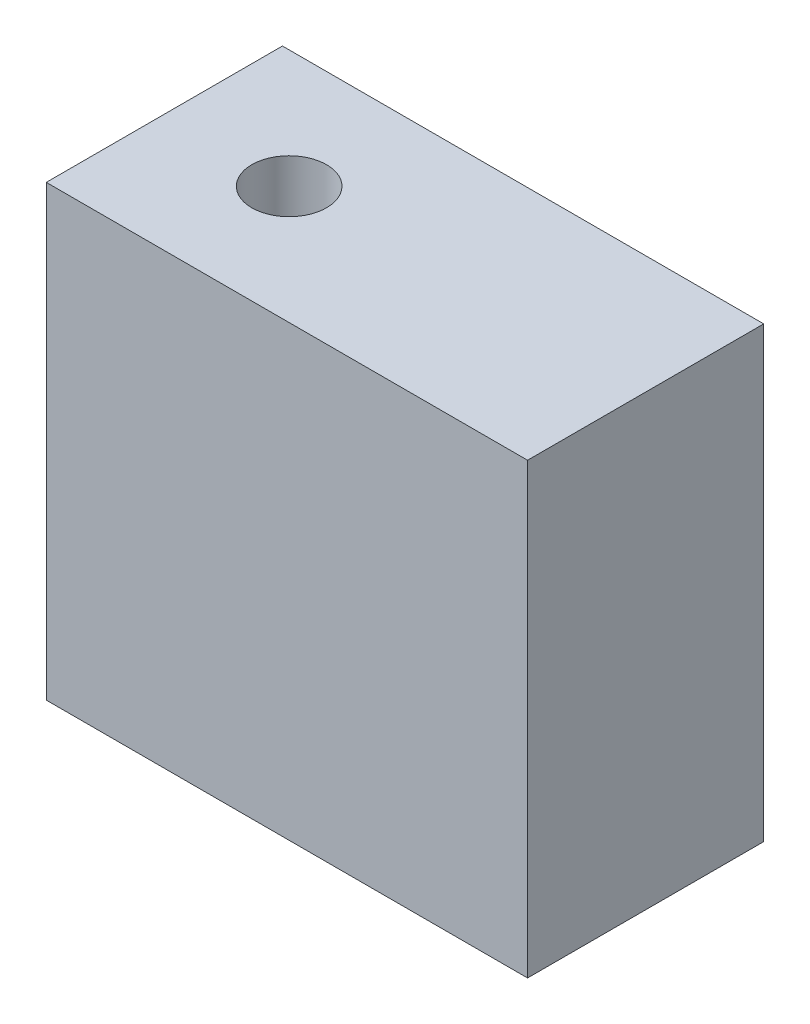
ISO-10303-21;
HEADER;
FILE_DESCRIPTION(('STEP AP214'),'2;1');
FILE_NAME('part.step','',(''),(''),'','','');
FILE_SCHEMA(('AUTOMOTIVE_DESIGN { 1 0 10303 214 1 1 1 1 }'));
ENDSEC;
DATA;
#1=APPLICATION_CONTEXT('core data for automotive mechanical design processes');
#2=APPLICATION_PROTOCOL_DEFINITION('international standard','automotive_design',2000,#1);
#3=PRODUCT_CONTEXT('',#1,'mechanical');
#4=PRODUCT('Part','Part','',(#3));
#5=PRODUCT_RELATED_PRODUCT_CATEGORY('part','',(#4));
#6=PRODUCT_DEFINITION_FORMATION('','',#4);
#7=PRODUCT_DEFINITION_CONTEXT('part definition',#1,'design');
#8=PRODUCT_DEFINITION('design','',#6,#7);
#9=PRODUCT_DEFINITION_SHAPE('','',#8);
#10=(LENGTH_UNIT() NAMED_UNIT(*) SI_UNIT(.MILLI.,.METRE.));
#11=(NAMED_UNIT(*) PLANE_ANGLE_UNIT() SI_UNIT($,.RADIAN.));
#12=(NAMED_UNIT(*) SI_UNIT($,.STERADIAN.) SOLID_ANGLE_UNIT());
#13=UNCERTAINTY_MEASURE_WITH_UNIT(LENGTH_MEASURE(1.E-05),#10,'distance_accuracy_value','');
#14=(GEOMETRIC_REPRESENTATION_CONTEXT(3) GLOBAL_UNCERTAINTY_ASSIGNED_CONTEXT((#13)) GLOBAL_UNIT_ASSIGNED_CONTEXT((#10,
#11,#12)) REPRESENTATION_CONTEXT('',''));
#15=CARTESIAN_POINT('',(0.,0.,0.));
#16=DIRECTION('',(0.,0.,1.));
#17=DIRECTION('',(1.,0.,0.));
#18=AXIS2_PLACEMENT_3D('',#15,#16,#17);
#19=CARTESIAN_POINT('',(0.,38.1,0.));
#20=DIRECTION('',(-1.,0.,0.));
#21=DIRECTION('',(0.,0.,1.));
#22=AXIS2_PLACEMENT_3D('',#19,#20,#21);
#23=PLANE('',#22);
#24=DIRECTION('',(0.,0.,-1.));
#25=VECTOR('',#24,1.);
#26=CARTESIAN_POINT('',(0.,0.,0.));
#27=LINE('',#26,#25);
#28=CARTESIAN_POINT('',(0.,0.,20.066));
#29=VERTEX_POINT('',#28);
#30=CARTESIAN_POINT('',(0.,0.,0.));
#31=VERTEX_POINT('',#30);
#32=EDGE_CURVE('E102',#29,#31,#27,.T.);
#33=ORIENTED_EDGE('',*,*,#32,.T.);
#34=DIRECTION('',(0.,-1.,0.));
#35=VECTOR('',#34,1.);
#36=CARTESIAN_POINT('',(0.,38.1,0.));
#37=LINE('',#36,#35);
#38=CARTESIAN_POINT('',(0.,38.1,0.));
#39=VERTEX_POINT('',#38);
#40=EDGE_CURVE('E11',#39,#31,#37,.T.);
#41=ORIENTED_EDGE('',*,*,#40,.F.);
#42=DIRECTION('',(0.,0.,-1.));
#43=VECTOR('',#42,1.);
#44=CARTESIAN_POINT('',(0.,38.1,0.));
#45=LINE('',#44,#43);
#46=CARTESIAN_POINT('',(0.,38.1,20.066));
#47=VERTEX_POINT('',#46);
#48=EDGE_CURVE('E90',#47,#39,#45,.T.);
#49=ORIENTED_EDGE('',*,*,#48,.F.);
#50=DIRECTION('',(0.,-1.,0.));
#51=VECTOR('',#50,1.);
#52=CARTESIAN_POINT('',(0.,38.1,20.066));
#53=LINE('',#52,#51);
#54=EDGE_CURVE('E98',#47,#29,#53,.T.);
#55=ORIENTED_EDGE('',*,*,#54,.T.);
#56=EDGE_LOOP('',(#33,#41,#49,#55));
#57=FACE_BOUND('',#56,.T.);
#58=ADVANCED_FACE('F39',(#57),#23,.F.);
#59=CARTESIAN_POINT('',(0.,38.1,0.));
#60=DIRECTION('',(0.,0.,1.));
#61=DIRECTION('',(1.,0.,0.));
#62=AXIS2_PLACEMENT_3D('',#59,#60,#61);
#63=PLANE('',#62);
#64=DIRECTION('',(-1.,0.,0.));
#65=VECTOR('',#64,1.);
#66=CARTESIAN_POINT('',(0.,0.,0.));
#67=LINE('',#66,#65);
#68=CARTESIAN_POINT('',(-40.894,0.,0.));
#69=VERTEX_POINT('',#68);
#70=EDGE_CURVE('E94',#31,#69,#67,.T.);
#71=ORIENTED_EDGE('',*,*,#70,.T.);
#72=DIRECTION('',(0.,-1.,0.));
#73=VECTOR('',#72,1.);
#74=CARTESIAN_POINT('',(-40.894,38.1,0.));
#75=LINE('',#74,#73);
#76=CARTESIAN_POINT('',(-40.894,38.1,0.));
#77=VERTEX_POINT('',#76);
#78=EDGE_CURVE('E47',#77,#69,#75,.T.);
#79=ORIENTED_EDGE('',*,*,#78,.F.);
#80=DIRECTION('',(-1.,0.,0.));
#81=VECTOR('',#80,1.);
#82=CARTESIAN_POINT('',(0.,38.1,0.));
#83=LINE('',#82,#81);
#84=EDGE_CURVE('E85',#39,#77,#83,.T.);
#85=ORIENTED_EDGE('',*,*,#84,.F.);
#86=ORIENTED_EDGE('',*,*,#40,.T.);
#87=EDGE_LOOP('',(#71,#79,#85,#86));
#88=FACE_BOUND('',#87,.T.);
#89=ADVANCED_FACE('F93',(#88),#63,.F.);
#90=CARTESIAN_POINT('',(-40.894,38.1,0.));
#91=DIRECTION('',(1.,0.,0.));
#92=DIRECTION('',(0.,0.,-1.));
#93=AXIS2_PLACEMENT_3D('',#90,#91,#92);
#94=PLANE('',#93);
#95=DIRECTION('',(0.,0.,1.));
#96=VECTOR('',#95,1.);
#97=CARTESIAN_POINT('',(-40.894,0.,0.));
#98=LINE('',#97,#96);
#99=CARTESIAN_POINT('',(-40.894,0.,20.066));
#100=VERTEX_POINT('',#99);
#101=EDGE_CURVE('E72',#69,#100,#98,.T.);
#102=ORIENTED_EDGE('',*,*,#101,.T.);
#103=DIRECTION('',(0.,-1.,0.));
#104=VECTOR('',#103,1.);
#105=CARTESIAN_POINT('',(-40.894,38.1,20.066));
#106=LINE('',#105,#104);
#107=CARTESIAN_POINT('',(-40.894,38.1,20.066));
#108=VERTEX_POINT('',#107);
#109=EDGE_CURVE('E95',#108,#100,#106,.T.);
#110=ORIENTED_EDGE('',*,*,#109,.F.);
#111=DIRECTION('',(0.,0.,1.));
#112=VECTOR('',#111,1.);
#113=CARTESIAN_POINT('',(-40.894,38.1,0.));
#114=LINE('',#113,#112);
#115=EDGE_CURVE('E88',#77,#108,#114,.T.);
#116=ORIENTED_EDGE('',*,*,#115,.F.);
#117=ORIENTED_EDGE('',*,*,#78,.T.);
#118=EDGE_LOOP('',(#102,#110,#116,#117));
#119=FACE_BOUND('',#118,.T.);
#120=ADVANCED_FACE('F96',(#119),#94,.F.);
#121=CARTESIAN_POINT('',(0.,38.1,20.066));
#122=DIRECTION('',(0.,0.,-1.));
#123=DIRECTION('',(-1.,0.,0.));
#124=AXIS2_PLACEMENT_3D('',#121,#122,#123);
#125=PLANE('',#124);
#126=DIRECTION('',(1.,0.,0.));
#127=VECTOR('',#126,1.);
#128=CARTESIAN_POINT('',(0.,0.,20.066));
#129=LINE('',#128,#127);
#130=EDGE_CURVE('E78',#100,#29,#129,.T.);
#131=ORIENTED_EDGE('',*,*,#130,.T.);
#132=ORIENTED_EDGE('',*,*,#54,.F.);
#133=DIRECTION('',(1.,0.,0.));
#134=VECTOR('',#133,1.);
#135=CARTESIAN_POINT('',(0.,38.1,20.066));
#136=LINE('',#135,#134);
#137=EDGE_CURVE('E55',#108,#47,#136,.T.);
#138=ORIENTED_EDGE('',*,*,#137,.F.);
#139=ORIENTED_EDGE('',*,*,#109,.T.);
#140=EDGE_LOOP('',(#131,#132,#138,#139));
#141=FACE_BOUND('',#140,.T.);
#142=ADVANCED_FACE('F110',(#141),#125,.F.);
#143=CARTESIAN_POINT('',(0.,38.1,0.));
#144=DIRECTION('',(0.,-1.,0.));
#145=DIRECTION('',(0.,0.,-1.));
#146=AXIS2_PLACEMENT_3D('',#143,#144,#145);
#147=PLANE('',#146);
#148=CARTESIAN_POINT('',(-30.2895,38.1,10.033));
#149=DIRECTION('',(0.,1.,0.));
#150=DIRECTION('',(0.,0.,1.));
#151=AXIS2_PLACEMENT_3D('',#148,#149,#150);
#152=CIRCLE('',#151,3.175);
#153=CARTESIAN_POINT('',(-30.2895,38.1,13.208));
#154=VERTEX_POINT('',#153);
#155=EDGE_CURVE('E116',#154,#154,#152,.T.);
#156=ORIENTED_EDGE('',*,*,#155,.F.);
#157=EDGE_LOOP('',(#156));
#158=FACE_BOUND('',#157,.T.);
#159=ORIENTED_EDGE('',*,*,#48,.T.);
#160=ORIENTED_EDGE('',*,*,#84,.T.);
#161=ORIENTED_EDGE('',*,*,#115,.T.);
#162=ORIENTED_EDGE('',*,*,#137,.T.);
#163=EDGE_LOOP('',(#159,#160,#161,#162));
#164=FACE_BOUND('',#163,.T.);
#165=ADVANCED_FACE('F86',(#158,#164),#147,.F.);
#166=CARTESIAN_POINT('',(0.,0.,0.));
#167=DIRECTION('',(0.,-1.,0.));
#168=DIRECTION('',(0.,0.,-1.));
#169=AXIS2_PLACEMENT_3D('',#166,#167,#168);
#170=PLANE('',#169);
#171=ORIENTED_EDGE('',*,*,#32,.F.);
#172=ORIENTED_EDGE('',*,*,#130,.F.);
#173=ORIENTED_EDGE('',*,*,#101,.F.);
#174=ORIENTED_EDGE('',*,*,#70,.F.);
#175=EDGE_LOOP('',(#171,#172,#173,#174));
#176=FACE_BOUND('',#175,.T.);
#177=ADVANCED_FACE('F113',(#176),#170,.T.);
#178=CARTESIAN_POINT('',(-30.2895,25.4,10.033));
#179=DIRECTION('',(0.,1.,0.));
#180=DIRECTION('',(0.,0.,1.));
#181=AXIS2_PLACEMENT_3D('',#178,#179,#180);
#182=CYLINDRICAL_SURFACE('',#181,3.175);
#183=CARTESIAN_POINT('',(-30.2895,25.4,10.033));
#184=DIRECTION('',(0.,1.,0.));
#185=DIRECTION('',(0.,0.,1.));
#186=AXIS2_PLACEMENT_3D('',#183,#184,#185);
#187=CIRCLE('',#186,3.175);
#188=CARTESIAN_POINT('',(-30.2895,25.4,13.208));
#189=VERTEX_POINT('',#188);
#190=EDGE_CURVE('E105',#189,#189,#187,.T.);
#191=ORIENTED_EDGE('',*,*,#190,.F.);
#192=EDGE_LOOP('',(#191));
#193=FACE_BOUND('',#192,.T.);
#194=ORIENTED_EDGE('',*,*,#155,.T.);
#195=EDGE_LOOP('',(#194));
#196=FACE_BOUND('',#195,.T.);
#197=ADVANCED_FACE('F124',(#193,#196),#182,.F.);
#198=CARTESIAN_POINT('',(-30.2895,25.4,10.033));
#199=DIRECTION('',(0.,1.,0.));
#200=DIRECTION('',(0.,0.,1.));
#201=AXIS2_PLACEMENT_3D('',#198,#199,#200);
#202=PLANE('',#201);
#203=ORIENTED_EDGE('',*,*,#190,.T.);
#204=EDGE_LOOP('',(#203));
#205=FACE_BOUND('',#204,.T.);
#206=ADVANCED_FACE('F122',(#205),#202,.T.);
#207=CLOSED_SHELL('',(#58,#89,#120,#142,#165,#177,#197,#206));
#208=MANIFOLD_SOLID_BREP('B2',#207);
#209=ADVANCED_BREP_SHAPE_REPRESENTATION('',(#18,#208),#14);
#210=SHAPE_DEFINITION_REPRESENTATION(#9,#209);
ENDSEC;
END-ISO-10303-21;
